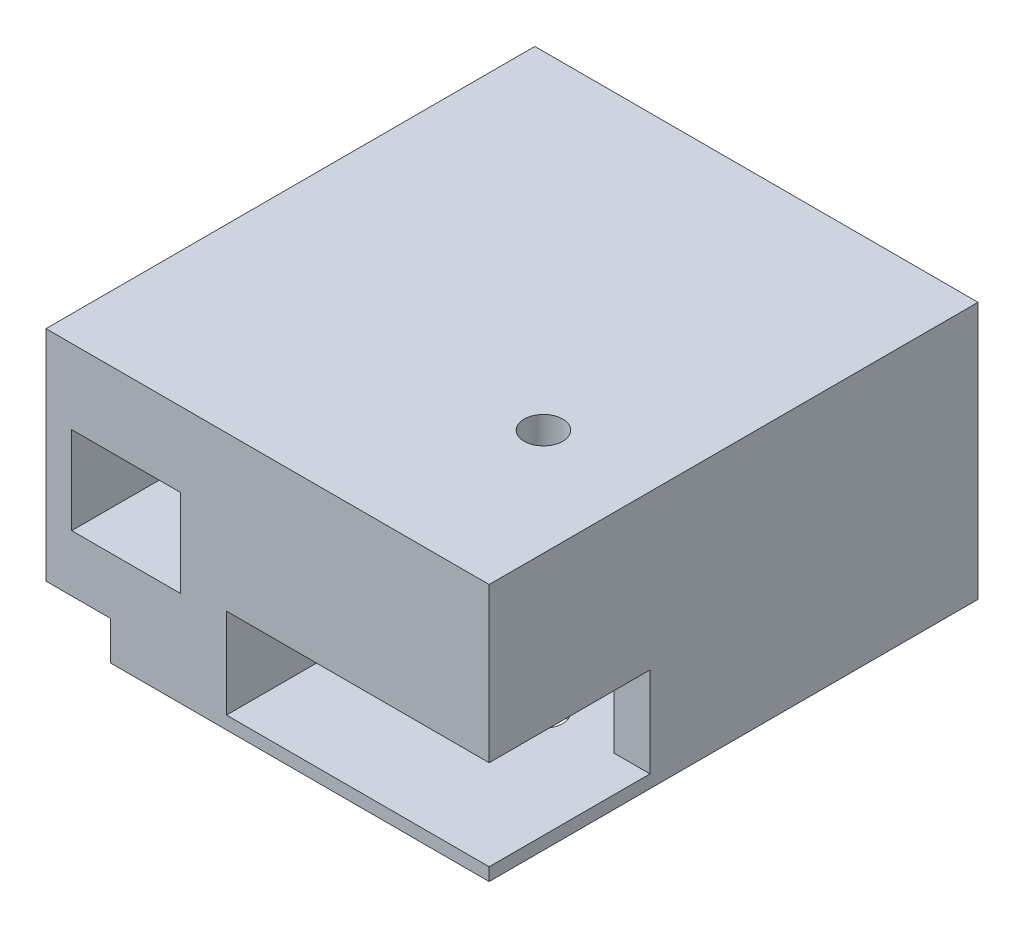
ISO-10303-21;
HEADER;
FILE_DESCRIPTION(('STEP AP214'),'2;1');
FILE_NAME('part.step','',(''),(''),'','','');
FILE_SCHEMA(('AUTOMOTIVE_DESIGN { 1 0 10303 214 1 1 1 1 }'));
ENDSEC;
DATA;
#1=APPLICATION_CONTEXT('core data for automotive mechanical design processes');
#2=APPLICATION_PROTOCOL_DEFINITION('international standard','automotive_design',2000,#1);
#3=PRODUCT_CONTEXT('',#1,'mechanical');
#4=PRODUCT('Part','Part','',(#3));
#5=PRODUCT_RELATED_PRODUCT_CATEGORY('part','',(#4));
#6=PRODUCT_DEFINITION_FORMATION('','',#4);
#7=PRODUCT_DEFINITION_CONTEXT('part definition',#1,'design');
#8=PRODUCT_DEFINITION('design','',#6,#7);
#9=PRODUCT_DEFINITION_SHAPE('','',#8);
#10=(LENGTH_UNIT() NAMED_UNIT(*) SI_UNIT(.MILLI.,.METRE.));
#11=(NAMED_UNIT(*) PLANE_ANGLE_UNIT() SI_UNIT($,.RADIAN.));
#12=(NAMED_UNIT(*) SI_UNIT($,.STERADIAN.) SOLID_ANGLE_UNIT());
#13=UNCERTAINTY_MEASURE_WITH_UNIT(LENGTH_MEASURE(1.E-05),#10,'distance_accuracy_value','');
#14=(GEOMETRIC_REPRESENTATION_CONTEXT(3) GLOBAL_UNCERTAINTY_ASSIGNED_CONTEXT((#13)) GLOBAL_UNIT_ASSIGNED_CONTEXT((#10,
#11,#12)) REPRESENTATION_CONTEXT('',''));
#15=CARTESIAN_POINT('',(0.,0.,0.));
#16=DIRECTION('',(0.,0.,1.));
#17=DIRECTION('',(1.,0.,0.));
#18=AXIS2_PLACEMENT_3D('',#15,#16,#17);
#19=CARTESIAN_POINT('',(13.8040015521384,-500000.,0.));
#20=DIRECTION('',(1.,0.,0.));
#21=DIRECTION('',(0.,0.,1.));
#22=AXIS2_PLACEMENT_3D('',#19,#20,#21);
#23=PLANE('',#22);
#24=DIRECTION('',(0.,-1.,0.));
#25=VECTOR('',#24,1.);
#26=CARTESIAN_POINT('',(13.8040015521384,27.0405469874742,20.7543072160116));
#27=LINE('',#26,#25);
#28=CARTESIAN_POINT('',(13.8040015521384,-2.62855974392551,20.7543072160116));
#29=VERTEX_POINT('',#28);
#30=CARTESIAN_POINT('',(13.8040015521384,4.37144025606545,20.7543072160116));
#31=VERTEX_POINT('',#30);
#32=EDGE_CURVE('E11',#29,#31,#27,.F.);
#33=ORIENTED_EDGE('',*,*,#32,.T.);
#34=DIRECTION('',(0.,0.,1.));
#35=VECTOR('',#34,1.);
#36=CARTESIAN_POINT('',(13.8040015521384,4.37144025606545,0.));
#37=LINE('',#36,#35);
#38=CARTESIAN_POINT('',(13.8040015521384,4.37144025606545,0.));
#39=VERTEX_POINT('',#38);
#40=EDGE_CURVE('E314',#39,#31,#37,.T.);
#41=ORIENTED_EDGE('',*,*,#40,.F.);
#42=DIRECTION('',(0.,1.,0.));
#43=VECTOR('',#42,1.);
#44=CARTESIAN_POINT('',(13.8040015521384,-500000.,0.));
#45=LINE('',#44,#43);
#46=CARTESIAN_POINT('',(13.8040015521384,-2.62855974403919,0.));
#47=VERTEX_POINT('',#46);
#48=EDGE_CURVE('E319',#47,#39,#45,.T.);
#49=ORIENTED_EDGE('',*,*,#48,.F.);
#50=DIRECTION('',(0.,0.,-1.));
#51=VECTOR('',#50,1.);
#52=CARTESIAN_POINT('',(13.8040015521384,-2.62855974392551,0.));
#53=LINE('',#52,#51);
#54=EDGE_CURVE('E322',#29,#47,#53,.T.);
#55=ORIENTED_EDGE('',*,*,#54,.F.);
#56=EDGE_LOOP('',(#33,#41,#49,#55));
#57=FACE_BOUND('',#56,.T.);
#58=ADVANCED_FACE('F35',(#57),#23,.F.);
#59=CARTESIAN_POINT('',(0.,4.37144025606545,38.));
#60=DIRECTION('',(0.,1.,0.));
#61=DIRECTION('',(0.,0.,-1.));
#62=AXIS2_PLACEMENT_3D('',#59,#60,#61);
#63=PLANE('',#62);
#64=DIRECTION('',(0.,0.,-1.));
#65=VECTOR('',#64,1.);
#66=CARTESIAN_POINT('',(-1.11381195359548,4.37144025606545,38.));
#67=LINE('',#66,#65);
#68=CARTESIAN_POINT('',(-1.11381195359548,4.37144025606545,38.));
#69=VERTEX_POINT('',#68);
#70=CARTESIAN_POINT('',(-1.11381195359548,4.37144025606545,0.));
#71=VERTEX_POINT('',#70);
#72=EDGE_CURVE('E240',#69,#71,#67,.T.);
#73=ORIENTED_EDGE('',*,*,#72,.T.);
#74=DIRECTION('',(-1.,0.,0.));
#75=VECTOR('',#74,1.);
#76=CARTESIAN_POINT('',(0.,4.37144025606545,0.));
#77=LINE('',#76,#75);
#78=EDGE_CURVE('E218',#39,#71,#77,.T.);
#79=ORIENTED_EDGE('',*,*,#78,.F.);
#80=ORIENTED_EDGE('',*,*,#40,.T.);
#81=CARTESIAN_POINT('',(11.0240015521384,4.37144025606545,25.5));
#82=DIRECTION('',(0.,-1.,0.));
#83=DIRECTION('',(0.,0.,-1.));
#84=AXIS2_PLACEMENT_3D('',#81,#82,#83);
#85=CIRCLE('',#84,5.5);
#86=CARTESIAN_POINT('',(16.5240015521383,4.37144025606545,25.5));
#87=VERTEX_POINT('',#86);
#88=EDGE_CURVE('E341',#31,#87,#85,.T.);
#89=ORIENTED_EDGE('',*,*,#88,.T.);
#90=DIRECTION('',(1.,0.,0.));
#91=VECTOR('',#90,1.);
#92=CARTESIAN_POINT('',(0.,4.37144025606545,25.5));
#93=LINE('',#92,#91);
#94=CARTESIAN_POINT('',(19.3040015521384,4.37144025606545,25.5));
#95=VERTEX_POINT('',#94);
#96=EDGE_CURVE('E338',#87,#95,#93,.T.);
#97=ORIENTED_EDGE('',*,*,#96,.T.);
#98=DIRECTION('',(0.,0.,1.));
#99=VECTOR('',#98,1.);
#100=CARTESIAN_POINT('',(19.3040015521384,4.37144025606545,0.));
#101=LINE('',#100,#99);
#102=CARTESIAN_POINT('',(19.3040015521384,4.37144025606545,38.));
#103=VERTEX_POINT('',#102);
#104=EDGE_CURVE('E333',#95,#103,#101,.T.);
#105=ORIENTED_EDGE('',*,*,#104,.T.);
#106=DIRECTION('',(-1.,0.,0.));
#107=VECTOR('',#106,1.);
#108=CARTESIAN_POINT('',(0.,4.37144025606545,38.));
#109=LINE('',#108,#107);
#110=EDGE_CURVE('E191',#103,#69,#109,.T.);
#111=ORIENTED_EDGE('',*,*,#110,.T.);
#112=EDGE_LOOP('',(#73,#79,#80,#89,#97,#105,#111));
#113=FACE_BOUND('',#112,.T.);
#114=CARTESIAN_POINT('',(11.0240015521384,4.37144025606545,25.5));
#115=DIRECTION('',(0.,-1.,0.));
#116=DIRECTION('',(0.,0.,-1.));
#117=AXIS2_PLACEMENT_3D('',#114,#115,#116);
#118=CIRCLE('',#117,1.5);
#119=CARTESIAN_POINT('',(12.5240015521384,4.37144025606545,25.5));
#120=VERTEX_POINT('',#119);
#121=EDGE_CURVE('E287',#120,#120,#118,.F.);
#122=ORIENTED_EDGE('',*,*,#121,.T.);
#123=EDGE_LOOP('',(#122));
#124=FACE_BOUND('',#123,.T.);
#125=ADVANCED_FACE('F360',(#113,#124),#63,.F.);
#126=CARTESIAN_POINT('',(0.,-2.62855974393456,38.));
#127=DIRECTION('',(0.,1.,0.));
#128=DIRECTION('',(-1.,0.,0.));
#129=AXIS2_PLACEMENT_3D('',#126,#127,#128);
#130=PLANE('',#129);
#131=CARTESIAN_POINT('',(11.0240015521384,-2.62855974393455,25.5));
#132=DIRECTION('',(0.,-1.,0.));
#133=DIRECTION('',(-1.,0.,0.));
#134=AXIS2_PLACEMENT_3D('',#131,#132,#133);
#135=CIRCLE('',#134,1.5);
#136=CARTESIAN_POINT('',(12.5240015521384,-2.62855974393455,25.5));
#137=VERTEX_POINT('',#136);
#138=EDGE_CURVE('E290',#137,#137,#135,.F.);
#139=ORIENTED_EDGE('',*,*,#138,.F.);
#140=EDGE_LOOP('',(#139));
#141=FACE_BOUND('',#140,.T.);
#142=DIRECTION('',(-1.,0.,0.));
#143=VECTOR('',#142,1.);
#144=CARTESIAN_POINT('',(0.,-2.62855974393456,38.));
#145=LINE('',#144,#143);
#146=CARTESIAN_POINT('',(19.3040015521384,-2.62855974393455,38.));
#147=VERTEX_POINT('',#146);
#148=CARTESIAN_POINT('',(-1.11381195359548,-2.62855974393456,38.));
#149=VERTEX_POINT('',#148);
#150=EDGE_CURVE('E167',#147,#149,#145,.T.);
#151=ORIENTED_EDGE('',*,*,#150,.F.);
#152=DIRECTION('',(0.,0.,1.));
#153=VECTOR('',#152,1.);
#154=CARTESIAN_POINT('',(19.3040015521384,-2.62855974393455,0.));
#155=LINE('',#154,#153);
#156=CARTESIAN_POINT('',(19.3040015521384,-2.62855974393455,25.5));
#157=VERTEX_POINT('',#156);
#158=EDGE_CURVE('E177',#157,#147,#155,.T.);
#159=ORIENTED_EDGE('',*,*,#158,.F.);
#160=DIRECTION('',(1.,0.,0.));
#161=VECTOR('',#160,1.);
#162=CARTESIAN_POINT('',(0.,-2.62855974393456,25.5));
#163=LINE('',#162,#161);
#164=CARTESIAN_POINT('',(16.5240015521384,-2.62855974393455,25.5));
#165=VERTEX_POINT('',#164);
#166=EDGE_CURVE('E335',#165,#157,#163,.T.);
#167=ORIENTED_EDGE('',*,*,#166,.F.);
#168=CARTESIAN_POINT('',(11.0240015521384,-2.62855974393455,25.5));
#169=DIRECTION('',(0.,-1.,0.));
#170=DIRECTION('',(-1.,0.,0.));
#171=AXIS2_PLACEMENT_3D('',#168,#169,#170);
#172=CIRCLE('',#171,5.5);
#173=EDGE_CURVE('E50',#29,#165,#172,.T.);
#174=ORIENTED_EDGE('',*,*,#173,.F.);
#175=ORIENTED_EDGE('',*,*,#54,.T.);
#176=DIRECTION('',(-1.,0.,0.));
#177=VECTOR('',#176,1.);
#178=CARTESIAN_POINT('',(0.,-2.62855974393456,0.));
#179=LINE('',#178,#177);
#180=CARTESIAN_POINT('',(-1.11381195359548,-2.62855974393456,0.));
#181=VERTEX_POINT('',#180);
#182=EDGE_CURVE('E213',#47,#181,#179,.T.);
#183=ORIENTED_EDGE('',*,*,#182,.T.);
#184=DIRECTION('',(0.,0.,-1.));
#185=VECTOR('',#184,1.);
#186=CARTESIAN_POINT('',(-1.11381195359548,-2.62855974393456,38.));
#187=LINE('',#186,#185);
#188=EDGE_CURVE('E188',#149,#181,#187,.T.);
#189=ORIENTED_EDGE('',*,*,#188,.F.);
#190=EDGE_LOOP('',(#151,#159,#167,#174,#175,#183,#189));
#191=FACE_BOUND('',#190,.T.);
#192=ADVANCED_FACE('F185',(#141,#191),#130,.T.);
#193=CARTESIAN_POINT('',(0.,3.77144025606545,38.));
#194=DIRECTION('',(0.,1.,0.));
#195=DIRECTION('',(-1.,0.,0.));
#196=AXIS2_PLACEMENT_3D('',#193,#194,#195);
#197=PLANE('',#196);
#198=DIRECTION('',(-1.,0.,0.));
#199=VECTOR('',#198,1.);
#200=CARTESIAN_POINT('',(0.,3.77144025606545,38.));
#201=LINE('',#200,#199);
#202=CARTESIAN_POINT('',(-4.69599844786163,3.77144025606545,38.));
#203=VERTEX_POINT('',#202);
#204=CARTESIAN_POINT('',(-13.1459984478616,3.77144025606545,38.));
#205=VERTEX_POINT('',#204);
#206=EDGE_CURVE('E206',#203,#205,#201,.T.);
#207=ORIENTED_EDGE('',*,*,#206,.F.);
#208=DIRECTION('',(0.,0.,-1.));
#209=VECTOR('',#208,1.);
#210=CARTESIAN_POINT('',(-4.69599844786163,3.77144025606545,38.));
#211=LINE('',#210,#209);
#212=CARTESIAN_POINT('',(-4.69599844786164,3.77144025606545,0.));
#213=VERTEX_POINT('',#212);
#214=EDGE_CURVE('E306',#203,#213,#211,.T.);
#215=ORIENTED_EDGE('',*,*,#214,.T.);
#216=DIRECTION('',(-1.,0.,0.));
#217=VECTOR('',#216,1.);
#218=CARTESIAN_POINT('',(0.,3.77144025606545,0.));
#219=LINE('',#218,#217);
#220=CARTESIAN_POINT('',(-13.1459984478616,3.77144025606545,0.));
#221=VERTEX_POINT('',#220);
#222=EDGE_CURVE('E226',#213,#221,#219,.T.);
#223=ORIENTED_EDGE('',*,*,#222,.T.);
#224=DIRECTION('',(0.,0.,1.));
#225=VECTOR('',#224,1.);
#226=CARTESIAN_POINT('',(-13.1459984478616,3.77144025606545,38.));
#227=LINE('',#226,#225);
#228=EDGE_CURVE('E309',#221,#205,#227,.T.);
#229=ORIENTED_EDGE('',*,*,#228,.T.);
#230=EDGE_LOOP('',(#207,#215,#223,#229));
#231=FACE_BOUND('',#230,.T.);
#232=ADVANCED_FACE('F410',(#231),#197,.T.);
#233=CARTESIAN_POINT('',(0.,10.5714402560654,38.));
#234=DIRECTION('',(0.,1.,0.));
#235=DIRECTION('',(-1.,0.,0.));
#236=AXIS2_PLACEMENT_3D('',#233,#234,#235);
#237=PLANE('',#236);
#238=DIRECTION('',(0.,0.,1.));
#239=VECTOR('',#238,1.);
#240=CARTESIAN_POINT('',(-13.1459984478616,10.5714402560579,38.));
#241=LINE('',#240,#239);
#242=CARTESIAN_POINT('',(-13.1459984478616,10.5714402560654,0.));
#243=VERTEX_POINT('',#242);
#244=CARTESIAN_POINT('',(-13.1459984478616,10.5714402560654,38.));
#245=VERTEX_POINT('',#244);
#246=EDGE_CURVE('E310',#243,#245,#241,.T.);
#247=ORIENTED_EDGE('',*,*,#246,.F.);
#248=DIRECTION('',(-1.,0.,0.));
#249=VECTOR('',#248,1.);
#250=CARTESIAN_POINT('',(0.,10.5714402560654,0.));
#251=LINE('',#250,#249);
#252=CARTESIAN_POINT('',(-4.69599844786164,10.5714402560654,0.));
#253=VERTEX_POINT('',#252);
#254=EDGE_CURVE('E223',#253,#243,#251,.T.);
#255=ORIENTED_EDGE('',*,*,#254,.F.);
#256=DIRECTION('',(0.,0.,-1.));
#257=VECTOR('',#256,1.);
#258=CARTESIAN_POINT('',(-4.69599844786163,10.5714402560579,38.));
#259=LINE('',#258,#257);
#260=CARTESIAN_POINT('',(-4.69599844786163,10.5714402560654,38.));
#261=VERTEX_POINT('',#260);
#262=EDGE_CURVE('E299',#261,#253,#259,.T.);
#263=ORIENTED_EDGE('',*,*,#262,.F.);
#264=DIRECTION('',(-1.,0.,0.));
#265=VECTOR('',#264,1.);
#266=CARTESIAN_POINT('',(0.,10.5714402560654,38.));
#267=LINE('',#266,#265);
#268=EDGE_CURVE('E204',#261,#245,#267,.T.);
#269=ORIENTED_EDGE('',*,*,#268,.T.);
#270=EDGE_LOOP('',(#247,#255,#263,#269));
#271=FACE_BOUND('',#270,.T.);
#272=ADVANCED_FACE('F412',(#271),#237,.F.);
#273=CARTESIAN_POINT('',(-10.1459984478616,0.,38.));
#274=DIRECTION('',(-1.,0.,0.));
#275=DIRECTION('',(0.,0.,-1.));
#276=AXIS2_PLACEMENT_3D('',#273,#274,#275);
#277=PLANE('',#276);
#278=DIRECTION('',(0.,0.,-1.));
#279=VECTOR('',#278,1.);
#280=CARTESIAN_POINT('',(-10.1459984478616,-3.62855974393455,38.));
#281=LINE('',#280,#279);
#282=CARTESIAN_POINT('',(-10.1459984478616,-3.62855974393455,38.));
#283=VERTEX_POINT('',#282);
#284=CARTESIAN_POINT('',(-10.1459984478616,-3.62855974393455,16.));
#285=VERTEX_POINT('',#284);
#286=EDGE_CURVE('E210',#283,#285,#281,.T.);
#287=ORIENTED_EDGE('',*,*,#286,.F.);
#288=DIRECTION('',(0.,-1.,0.));
#289=VECTOR('',#288,1.);
#290=CARTESIAN_POINT('',(-10.1459984478616,0.,38.));
#291=LINE('',#290,#289);
#292=CARTESIAN_POINT('',(-10.1459984478616,-0.628559743934557,38.));
#293=VERTEX_POINT('',#292);
#294=EDGE_CURVE('E193',#293,#283,#291,.T.);
#295=ORIENTED_EDGE('',*,*,#294,.F.);
#296=DIRECTION('',(0.,0.,-1.));
#297=VECTOR('',#296,1.);
#298=CARTESIAN_POINT('',(-10.1459984478616,-0.628559743934557,38.));
#299=LINE('',#298,#297);
#300=CARTESIAN_POINT('',(-10.1459984478616,-0.628559743934557,16.));
#301=VERTEX_POINT('',#300);
#302=EDGE_CURVE('E43',#293,#301,#299,.T.);
#303=ORIENTED_EDGE('',*,*,#302,.T.);
#304=DIRECTION('',(0.,-1.,0.));
#305=VECTOR('',#304,1.);
#306=CARTESIAN_POINT('',(-10.1459984478616,0.,16.));
#307=LINE('',#306,#305);
#308=EDGE_CURVE('E173',#301,#285,#307,.T.);
#309=ORIENTED_EDGE('',*,*,#308,.T.);
#310=EDGE_LOOP('',(#287,#295,#303,#309));
#311=FACE_BOUND('',#310,.T.);
#312=ADVANCED_FACE('F37',(#311),#277,.T.);
#313=CARTESIAN_POINT('',(0.,-0.628559743934557,38.));
#314=DIRECTION('',(0.,-1.,0.));
#315=DIRECTION('',(0.,0.,1.));
#316=AXIS2_PLACEMENT_3D('',#313,#314,#315);
#317=PLANE('',#316);
#318=ORIENTED_EDGE('',*,*,#302,.F.);
#319=DIRECTION('',(1.,0.,0.));
#320=VECTOR('',#319,1.);
#321=CARTESIAN_POINT('',(0.,-0.628559743934557,38.));
#322=LINE('',#321,#320);
#323=CARTESIAN_POINT('',(-15.1459984478616,-0.628559743934557,38.));
#324=VERTEX_POINT('',#323);
#325=EDGE_CURVE('E208',#324,#293,#322,.T.);
#326=ORIENTED_EDGE('',*,*,#325,.F.);
#327=DIRECTION('',(0.,0.,-1.));
#328=VECTOR('',#327,1.);
#329=CARTESIAN_POINT('',(-15.1459984478616,-0.628559743934557,38.));
#330=LINE('',#329,#328);
#331=CARTESIAN_POINT('',(-15.1459984478616,-0.628559743934557,16.));
#332=VERTEX_POINT('',#331);
#333=EDGE_CURVE('E234',#324,#332,#330,.T.);
#334=ORIENTED_EDGE('',*,*,#333,.T.);
#335=DIRECTION('',(1.,0.,0.));
#336=VECTOR('',#335,1.);
#337=CARTESIAN_POINT('',(0.,-0.628559743934557,16.));
#338=LINE('',#337,#336);
#339=EDGE_CURVE('E257',#332,#301,#338,.T.);
#340=ORIENTED_EDGE('',*,*,#339,.T.);
#341=EDGE_LOOP('',(#318,#326,#334,#340));
#342=FACE_BOUND('',#341,.T.);
#343=ADVANCED_FACE('F268',(#342),#317,.T.);
#344=CARTESIAN_POINT('',(-15.1459984478616,0.,38.));
#345=DIRECTION('',(1.,0.,0.));
#346=DIRECTION('',(0.,0.,1.));
#347=AXIS2_PLACEMENT_3D('',#344,#345,#346);
#348=PLANE('',#347);
#349=CARTESIAN_POINT('',(-15.1459984478616,7.07285546333414,5.5));
#350=DIRECTION('',(1.,0.,0.));
#351=DIRECTION('',(0.,0.,-1.));
#352=AXIS2_PLACEMENT_3D('',#349,#350,#351);
#353=CIRCLE('',#352,1.5);
#354=CARTESIAN_POINT('',(-15.1459984478616,7.07285546333414,4.));
#355=VERTEX_POINT('',#354);
#356=EDGE_CURVE('E326',#355,#355,#353,.T.);
#357=ORIENTED_EDGE('',*,*,#356,.T.);
#358=EDGE_LOOP('',(#357));
#359=FACE_BOUND('',#358,.T.);
#360=DIRECTION('',(0.,1.,0.));
#361=VECTOR('',#360,1.);
#362=CARTESIAN_POINT('',(-15.1459984478616,0.,0.));
#363=LINE('',#362,#361);
#364=CARTESIAN_POINT('',(-15.1459984478616,-3.62855974393455,0.));
#365=VERTEX_POINT('',#364);
#366=CARTESIAN_POINT('',(-15.1459984478616,16.3714402560654,0.));
#367=VERTEX_POINT('',#366);
#368=EDGE_CURVE('E229',#365,#367,#363,.T.);
#369=ORIENTED_EDGE('',*,*,#368,.F.);
#370=DIRECTION('',(0.,0.,-1.));
#371=VECTOR('',#370,1.);
#372=CARTESIAN_POINT('',(-15.1459984478616,-3.62855974393455,16.));
#373=LINE('',#372,#371);
#374=CARTESIAN_POINT('',(-15.1459984478616,-3.62855974393455,16.));
#375=VERTEX_POINT('',#374);
#376=EDGE_CURVE('E214',#375,#365,#373,.T.);
#377=ORIENTED_EDGE('',*,*,#376,.F.);
#378=DIRECTION('',(0.,1.,0.));
#379=VECTOR('',#378,1.);
#380=CARTESIAN_POINT('',(-15.1459984478616,0.,16.));
#381=LINE('',#380,#379);
#382=EDGE_CURVE('E259',#375,#332,#381,.T.);
#383=ORIENTED_EDGE('',*,*,#382,.T.);
#384=ORIENTED_EDGE('',*,*,#333,.F.);
#385=DIRECTION('',(0.,1.,0.));
#386=VECTOR('',#385,1.);
#387=CARTESIAN_POINT('',(-15.1459984478616,0.,38.));
#388=LINE('',#387,#386);
#389=CARTESIAN_POINT('',(-15.1459984478616,16.3714402560654,38.));
#390=VERTEX_POINT('',#389);
#391=EDGE_CURVE('E201',#324,#390,#388,.T.);
#392=ORIENTED_EDGE('',*,*,#391,.T.);
#393=DIRECTION('',(0.,0.,-1.));
#394=VECTOR('',#393,1.);
#395=CARTESIAN_POINT('',(-15.1459984478616,16.3714402560654,38.));
#396=LINE('',#395,#394);
#397=EDGE_CURVE('E237',#390,#367,#396,.T.);
#398=ORIENTED_EDGE('',*,*,#397,.T.);
#399=EDGE_LOOP('',(#369,#377,#383,#384,#392,#398));
#400=FACE_BOUND('',#399,.T.);
#401=ADVANCED_FACE('F273',(#359,#400),#348,.F.);
#402=CARTESIAN_POINT('',(0.,16.3714402560654,38.));
#403=DIRECTION('',(0.,1.,0.));
#404=DIRECTION('',(-1.,0.,0.));
#405=AXIS2_PLACEMENT_3D('',#402,#403,#404);
#406=PLANE('',#405);
#407=CARTESIAN_POINT('',(11.0240015521384,16.3714402560654,25.5));
#408=DIRECTION('',(0.,-1.,0.));
#409=DIRECTION('',(-1.,0.,0.));
#410=AXIS2_PLACEMENT_3D('',#407,#408,#409);
#411=CIRCLE('',#410,1.5);
#412=CARTESIAN_POINT('',(12.5240015521383,16.3714402560655,25.5));
#413=VERTEX_POINT('',#412);
#414=EDGE_CURVE('E293',#413,#413,#411,.T.);
#415=ORIENTED_EDGE('',*,*,#414,.T.);
#416=EDGE_LOOP('',(#415));
#417=FACE_BOUND('',#416,.T.);
#418=DIRECTION('',(-1.,0.,0.));
#419=VECTOR('',#418,1.);
#420=CARTESIAN_POINT('',(0.,16.3714402560654,38.));
#421=LINE('',#420,#419);
#422=CARTESIAN_POINT('',(19.3040015521384,16.3714402560655,38.));
#423=VERTEX_POINT('',#422);
#424=EDGE_CURVE('E199',#423,#390,#421,.T.);
#425=ORIENTED_EDGE('',*,*,#424,.F.);
#426=DIRECTION('',(0.,0.,-1.));
#427=VECTOR('',#426,1.);
#428=CARTESIAN_POINT('',(19.3040015521384,16.3714402560655,0.));
#429=LINE('',#428,#427);
#430=CARTESIAN_POINT('',(19.3040015521384,16.3714402560655,0.));
#431=VERTEX_POINT('',#430);
#432=EDGE_CURVE('E283',#423,#431,#429,.T.);
#433=ORIENTED_EDGE('',*,*,#432,.T.);
#434=DIRECTION('',(-1.,0.,0.));
#435=VECTOR('',#434,1.);
#436=CARTESIAN_POINT('',(0.,16.3714402560654,0.));
#437=LINE('',#436,#435);
#438=EDGE_CURVE('E221',#431,#367,#437,.T.);
#439=ORIENTED_EDGE('',*,*,#438,.T.);
#440=ORIENTED_EDGE('',*,*,#397,.F.);
#441=EDGE_LOOP('',(#425,#433,#439,#440));
#442=FACE_BOUND('',#441,.T.);
#443=ADVANCED_FACE('F365',(#417,#442),#406,.T.);
#444=CARTESIAN_POINT('',(-1.11381195359548,0.,38.));
#445=DIRECTION('',(-1.,0.,0.));
#446=DIRECTION('',(0.,-1.,0.));
#447=AXIS2_PLACEMENT_3D('',#444,#445,#446);
#448=PLANE('',#447);
#449=DIRECTION('',(0.,-1.,0.));
#450=VECTOR('',#449,1.);
#451=CARTESIAN_POINT('',(-1.11381195359548,0.,0.));
#452=LINE('',#451,#450);
#453=EDGE_CURVE('E216',#71,#181,#452,.T.);
#454=ORIENTED_EDGE('',*,*,#453,.F.);
#455=ORIENTED_EDGE('',*,*,#72,.F.);
#456=DIRECTION('',(0.,-1.,0.));
#457=VECTOR('',#456,1.);
#458=CARTESIAN_POINT('',(-1.11381195359548,0.,38.));
#459=LINE('',#458,#457);
#460=EDGE_CURVE('E189',#69,#149,#459,.T.);
#461=ORIENTED_EDGE('',*,*,#460,.T.);
#462=ORIENTED_EDGE('',*,*,#188,.T.);
#463=EDGE_LOOP('',(#454,#455,#461,#462));
#464=FACE_BOUND('',#463,.T.);
#465=ADVANCED_FACE('F357',(#464),#448,.F.);
#466=CARTESIAN_POINT('',(0.,-3.62855974393455,38.));
#467=DIRECTION('',(0.,1.,0.));
#468=DIRECTION('',(-1.,0.,0.));
#469=AXIS2_PLACEMENT_3D('',#466,#467,#468);
#470=PLANE('',#469);
#471=CARTESIAN_POINT('',(11.0240015521384,-3.62855974393455,25.5));
#472=DIRECTION('',(0.,-1.,0.));
#473=DIRECTION('',(-1.,0.,0.));
#474=AXIS2_PLACEMENT_3D('',#471,#472,#473);
#475=CIRCLE('',#474,1.5);
#476=CARTESIAN_POINT('',(12.5240015521384,-3.62855974393455,25.5));
#477=VERTEX_POINT('',#476);
#478=EDGE_CURVE('E296',#477,#477,#475,.F.);
#479=ORIENTED_EDGE('',*,*,#478,.T.);
#480=EDGE_LOOP('',(#479));
#481=FACE_BOUND('',#480,.T.);
#482=ORIENTED_EDGE('',*,*,#286,.T.);
#483=DIRECTION('',(-1.,0.,0.));
#484=VECTOR('',#483,1.);
#485=CARTESIAN_POINT('',(0.,-3.62855974393455,16.));
#486=LINE('',#485,#484);
#487=EDGE_CURVE('E248',#285,#375,#486,.T.);
#488=ORIENTED_EDGE('',*,*,#487,.T.);
#489=ORIENTED_EDGE('',*,*,#376,.T.);
#490=DIRECTION('',(-1.,0.,0.));
#491=VECTOR('',#490,1.);
#492=CARTESIAN_POINT('',(0.,-3.62855974393455,0.));
#493=LINE('',#492,#491);
#494=CARTESIAN_POINT('',(19.3040015521384,-3.62855974393455,0.));
#495=VERTEX_POINT('',#494);
#496=EDGE_CURVE('E211',#495,#365,#493,.T.);
#497=ORIENTED_EDGE('',*,*,#496,.F.);
#498=DIRECTION('',(0.,0.,1.));
#499=VECTOR('',#498,1.);
#500=CARTESIAN_POINT('',(19.3040015521384,-3.62855974393455,0.));
#501=LINE('',#500,#499);
#502=CARTESIAN_POINT('',(19.3040015521384,-3.62855974393455,38.));
#503=VERTEX_POINT('',#502);
#504=EDGE_CURVE('E275',#495,#503,#501,.T.);
#505=ORIENTED_EDGE('',*,*,#504,.T.);
#506=DIRECTION('',(-1.,0.,0.));
#507=VECTOR('',#506,1.);
#508=CARTESIAN_POINT('',(0.,-3.62855974393455,38.));
#509=LINE('',#508,#507);
#510=EDGE_CURVE('E169',#503,#283,#509,.T.);
#511=ORIENTED_EDGE('',*,*,#510,.T.);
#512=EDGE_LOOP('',(#482,#488,#489,#497,#505,#511));
#513=FACE_BOUND('',#512,.T.);
#514=ADVANCED_FACE('F246',(#481,#513),#470,.F.);
#515=CARTESIAN_POINT('',(0.,0.,38.));
#516=DIRECTION('',(0.,0.,-1.));
#517=DIRECTION('',(1.,0.,0.));
#518=AXIS2_PLACEMENT_3D('',#515,#516,#517);
#519=PLANE('',#518);
#520=DIRECTION('',(0.,1.,0.));
#521=VECTOR('',#520,1.);
#522=CARTESIAN_POINT('',(19.3040015521384,-2.62855974393455,38.));
#523=LINE('',#522,#521);
#524=EDGE_CURVE('E174',#103,#423,#523,.T.);
#525=ORIENTED_EDGE('',*,*,#524,.T.);
#526=ORIENTED_EDGE('',*,*,#424,.T.);
#527=ORIENTED_EDGE('',*,*,#391,.F.);
#528=ORIENTED_EDGE('',*,*,#325,.T.);
#529=ORIENTED_EDGE('',*,*,#294,.T.);
#530=ORIENTED_EDGE('',*,*,#510,.F.);
#531=EDGE_CURVE('E163',#503,#147,#523,.T.);
#532=ORIENTED_EDGE('',*,*,#531,.T.);
#533=ORIENTED_EDGE('',*,*,#150,.T.);
#534=ORIENTED_EDGE('',*,*,#460,.F.);
#535=ORIENTED_EDGE('',*,*,#110,.F.);
#536=EDGE_LOOP('',(#525,#526,#527,#528,#529,#530,#532,#533,#534,#535));
#537=FACE_BOUND('',#536,.T.);
#538=DIRECTION('',(0.,-1.,0.));
#539=VECTOR('',#538,1.);
#540=CARTESIAN_POINT('',(-4.6959984479313,500000.,38.));
#541=LINE('',#540,#539);
#542=EDGE_CURVE('E302',#261,#203,#541,.T.);
#543=ORIENTED_EDGE('',*,*,#542,.T.);
#544=ORIENTED_EDGE('',*,*,#206,.T.);
#545=DIRECTION('',(0.,-1.,0.));
#546=VECTOR('',#545,1.);
#547=CARTESIAN_POINT('',(-13.1459984479313,500000.,38.));
#548=LINE('',#547,#546);
#549=EDGE_CURVE('E58',#245,#205,#548,.T.);
#550=ORIENTED_EDGE('',*,*,#549,.F.);
#551=ORIENTED_EDGE('',*,*,#268,.F.);
#552=EDGE_LOOP('',(#543,#544,#550,#551));
#553=FACE_BOUND('',#552,.T.);
#554=ADVANCED_FACE('F165',(#537,#553),#519,.F.);
#555=CARTESIAN_POINT('',(0.,0.,0.));
#556=DIRECTION('',(0.,0.,-1.));
#557=DIRECTION('',(1.,0.,0.));
#558=AXIS2_PLACEMENT_3D('',#555,#556,#557);
#559=PLANE('',#558);
#560=ORIENTED_EDGE('',*,*,#48,.T.);
#561=ORIENTED_EDGE('',*,*,#78,.T.);
#562=ORIENTED_EDGE('',*,*,#453,.T.);
#563=ORIENTED_EDGE('',*,*,#182,.F.);
#564=EDGE_LOOP('',(#560,#561,#562,#563));
#565=FACE_BOUND('',#564,.T.);
#566=ORIENTED_EDGE('',*,*,#438,.F.);
#567=DIRECTION('',(0.,-1.,0.));
#568=VECTOR('',#567,1.);
#569=CARTESIAN_POINT('',(19.3040015521384,-2.62855974393455,0.));
#570=LINE('',#569,#568);
#571=EDGE_CURVE('E280',#431,#495,#570,.T.);
#572=ORIENTED_EDGE('',*,*,#571,.T.);
#573=ORIENTED_EDGE('',*,*,#496,.T.);
#574=ORIENTED_EDGE('',*,*,#368,.T.);
#575=EDGE_LOOP('',(#566,#572,#573,#574));
#576=FACE_BOUND('',#575,.T.);
#577=ORIENTED_EDGE('',*,*,#254,.T.);
#578=DIRECTION('',(0.,-1.,0.));
#579=VECTOR('',#578,1.);
#580=CARTESIAN_POINT('',(-13.1459984479313,500000.,0.));
#581=LINE('',#580,#579);
#582=EDGE_CURVE('E313',#243,#221,#581,.T.);
#583=ORIENTED_EDGE('',*,*,#582,.T.);
#584=ORIENTED_EDGE('',*,*,#222,.F.);
#585=DIRECTION('',(0.,-1.,0.));
#586=VECTOR('',#585,1.);
#587=CARTESIAN_POINT('',(-4.69599844793131,500000.,0.));
#588=LINE('',#587,#586);
#589=EDGE_CURVE('E304',#253,#213,#588,.T.);
#590=ORIENTED_EDGE('',*,*,#589,.F.);
#591=EDGE_LOOP('',(#577,#583,#584,#590));
#592=FACE_BOUND('',#591,.T.);
#593=ADVANCED_FACE('F278',(#565,#576,#592),#559,.T.);
#594=CARTESIAN_POINT('',(0.,0.,16.));
#595=DIRECTION('',(0.,0.,-1.));
#596=DIRECTION('',(1.,0.,0.));
#597=AXIS2_PLACEMENT_3D('',#594,#595,#596);
#598=PLANE('',#597);
#599=ORIENTED_EDGE('',*,*,#308,.F.);
#600=ORIENTED_EDGE('',*,*,#339,.F.);
#601=ORIENTED_EDGE('',*,*,#382,.F.);
#602=ORIENTED_EDGE('',*,*,#487,.F.);
#603=EDGE_LOOP('',(#599,#600,#601,#602));
#604=FACE_BOUND('',#603,.T.);
#605=ADVANCED_FACE('F269',(#604),#598,.F.);
#606=CARTESIAN_POINT('',(19.3040015521384,0.,0.));
#607=DIRECTION('',(1.,0.,0.));
#608=DIRECTION('',(0.,0.,1.));
#609=AXIS2_PLACEMENT_3D('',#606,#607,#608);
#610=PLANE('',#609);
#611=ORIENTED_EDGE('',*,*,#104,.F.);
#612=DIRECTION('',(0.,-1.,0.));
#613=VECTOR('',#612,1.);
#614=CARTESIAN_POINT('',(19.3040015521383,27.0405469874742,25.5));
#615=LINE('',#614,#613);
#616=EDGE_CURVE('E180',#95,#157,#615,.T.);
#617=ORIENTED_EDGE('',*,*,#616,.T.);
#618=ORIENTED_EDGE('',*,*,#158,.T.);
#619=ORIENTED_EDGE('',*,*,#531,.F.);
#620=ORIENTED_EDGE('',*,*,#504,.F.);
#621=ORIENTED_EDGE('',*,*,#571,.F.);
#622=ORIENTED_EDGE('',*,*,#432,.F.);
#623=ORIENTED_EDGE('',*,*,#524,.F.);
#624=EDGE_LOOP('',(#611,#617,#618,#619,#620,#621,#622,#623));
#625=FACE_BOUND('',#624,.T.);
#626=ADVANCED_FACE('F179',(#625),#610,.T.);
#627=CARTESIAN_POINT('',(11.0240015521384,20.6140809431847,25.5));
#628=DIRECTION('',(0.,-1.,0.));
#629=DIRECTION('',(1.,0.,0.));
#630=AXIS2_PLACEMENT_3D('',#627,#628,#629);
#631=CYLINDRICAL_SURFACE('',#630,1.5);
#632=CARTESIAN_POINT('',(12.5240015521384,-2.62855974393455,25.5));
#633=CARTESIAN_POINT('',(12.5240015521384,-2.63897641060122,25.5));
#634=CARTESIAN_POINT('',(12.5240015521384,-2.64939307726788,25.5));
#635=CARTESIAN_POINT('',(12.5240015521384,-2.67022641060122,25.5));
#636=CARTESIAN_POINT('',(12.5240015521384,-2.68064307726788,25.5));
#637=CARTESIAN_POINT('',(12.5240015521384,-2.70147641060122,25.5));
#638=CARTESIAN_POINT('',(12.5240015521384,-2.71189307726788,25.5));
#639=CARTESIAN_POINT('',(12.5240015521384,-2.73272641060122,25.5));
#640=CARTESIAN_POINT('',(12.5240015521384,-2.74314307726788,25.5));
#641=CARTESIAN_POINT('',(12.5240015521384,-2.76397641060122,25.5));
#642=CARTESIAN_POINT('',(12.5240015521384,-2.77439307726788,25.5));
#643=CARTESIAN_POINT('',(12.5240015521384,-2.79522641060122,25.5));
#644=CARTESIAN_POINT('',(12.5240015521384,-2.80564307726788,25.5));
#645=CARTESIAN_POINT('',(12.5240015521384,-2.82647641060122,25.5));
#646=CARTESIAN_POINT('',(12.5240015521384,-2.83689307726788,25.5));
#647=CARTESIAN_POINT('',(12.5240015521384,-2.85772641060122,25.5));
#648=CARTESIAN_POINT('',(12.5240015521384,-2.86814307726788,25.5));
#649=CARTESIAN_POINT('',(12.5240015521384,-2.88897641060122,25.5));
#650=CARTESIAN_POINT('',(12.5240015521384,-2.89939307726788,25.5));
#651=CARTESIAN_POINT('',(12.5240015521384,-2.92022641060122,25.5));
#652=CARTESIAN_POINT('',(12.5240015521384,-2.93064307726788,25.5));
#653=CARTESIAN_POINT('',(12.5240015521384,-2.95147641060122,25.5));
#654=CARTESIAN_POINT('',(12.5240015521384,-2.96189307726788,25.5));
#655=CARTESIAN_POINT('',(12.5240015521384,-2.98272641060122,25.5));
#656=CARTESIAN_POINT('',(12.5240015521384,-2.99314307726788,25.5));
#657=CARTESIAN_POINT('',(12.5240015521384,-3.01397641060122,25.5));
#658=CARTESIAN_POINT('',(12.5240015521384,-3.02439307726788,25.5));
#659=CARTESIAN_POINT('',(12.5240015521384,-3.04522641060122,25.5));
#660=CARTESIAN_POINT('',(12.5240015521384,-3.05564307726788,25.5));
#661=CARTESIAN_POINT('',(12.5240015521384,-3.07647641060122,25.5));
#662=CARTESIAN_POINT('',(12.5240015521384,-3.08689307726788,25.5));
#663=CARTESIAN_POINT('',(12.5240015521384,-3.10772641060122,25.5));
#664=CARTESIAN_POINT('',(12.5240015521384,-3.11814307726788,25.5));
#665=CARTESIAN_POINT('',(12.5240015521384,-3.13897641060122,25.5));
#666=CARTESIAN_POINT('',(12.5240015521384,-3.14939307726788,25.5));
#667=CARTESIAN_POINT('',(12.5240015521384,-3.17022641060122,25.5));
#668=CARTESIAN_POINT('',(12.5240015521384,-3.18064307726788,25.5));
#669=CARTESIAN_POINT('',(12.5240015521384,-3.20147641060122,25.5));
#670=CARTESIAN_POINT('',(12.5240015521384,-3.21189307726788,25.5));
#671=CARTESIAN_POINT('',(12.5240015521384,-3.23272641060122,25.5));
#672=CARTESIAN_POINT('',(12.5240015521384,-3.24314307726788,25.5));
#673=CARTESIAN_POINT('',(12.5240015521384,-3.26397641060122,25.5));
#674=CARTESIAN_POINT('',(12.5240015521384,-3.27439307726788,25.5));
#675=CARTESIAN_POINT('',(12.5240015521384,-3.29522641060122,25.5));
#676=CARTESIAN_POINT('',(12.5240015521384,-3.30564307726788,25.5));
#677=CARTESIAN_POINT('',(12.5240015521384,-3.32647641060122,25.5));
#678=CARTESIAN_POINT('',(12.5240015521384,-3.33689307726788,25.5));
#679=CARTESIAN_POINT('',(12.5240015521384,-3.35772641060122,25.5));
#680=CARTESIAN_POINT('',(12.5240015521384,-3.36814307726788,25.5));
#681=CARTESIAN_POINT('',(12.5240015521384,-3.38897641060122,25.5));
#682=CARTESIAN_POINT('',(12.5240015521384,-3.39939307726788,25.5));
#683=CARTESIAN_POINT('',(12.5240015521384,-3.42022641060122,25.5));
#684=CARTESIAN_POINT('',(12.5240015521384,-3.43064307726788,25.5));
#685=CARTESIAN_POINT('',(12.5240015521384,-3.45147641060122,25.5));
#686=CARTESIAN_POINT('',(12.5240015521384,-3.46189307726788,25.5));
#687=CARTESIAN_POINT('',(12.5240015521384,-3.48272641060122,25.5));
#688=CARTESIAN_POINT('',(12.5240015521384,-3.49314307726788,25.5));
#689=CARTESIAN_POINT('',(12.5240015521384,-3.51397641060122,25.5));
#690=CARTESIAN_POINT('',(12.5240015521384,-3.52439307726788,25.5));
#691=CARTESIAN_POINT('',(12.5240015521384,-3.54522641060122,25.5));
#692=CARTESIAN_POINT('',(12.5240015521384,-3.55564307726788,25.5));
#693=CARTESIAN_POINT('',(12.5240015521384,-3.57647641060122,25.5));
#694=CARTESIAN_POINT('',(12.5240015521384,-3.58689307726788,25.5));
#695=CARTESIAN_POINT('',(12.5240015521384,-3.60772641060122,25.5));
#696=CARTESIAN_POINT('',(12.5240015521384,-3.61814307726788,25.5));
#697=CARTESIAN_POINT('',(12.5240015521384,-3.62855974393455,25.5));
#698=B_SPLINE_CURVE_WITH_KNOTS('',3,(#632,#633,#634,#635,#636,#637,#638,#639,#640,#641,#642,
#643,#644,#645,#646,#647,#648,#649,#650,#651,#652,#653,#654,#655,#656,#657,#658,#659,#660,#661,
#662,#663,#664,#665,#666,#667,#668,#669,#670,#671,#672,#673,#674,#675,#676,#677,#678,#679,#680,
#681,#682,#683,#684,#685,#686,#687,#688,#689,#690,#691,#692,#693,#694,#695,#696,#697),
.UNSPECIFIED.,.F.,.F.,(4,2,2,2,2,2,2,2,2,2,2,2,2,2,2,2,2,2,2,2,2,2,2,2,2,2,2,2,2,2,2,2,4),(0.,
0.03125,0.0625000000000001,0.0937500000000001,0.125,0.15625,0.1875,0.21875,0.25,0.28125,0.3125,
0.34375,0.375,0.40625,0.4375,0.46875,0.5,0.53125,0.5625,0.593750000000001,0.625000000000001,
0.656250000000001,0.687500000000001,0.718750000000001,0.750000000000001,0.781250000000001,
0.812500000000001,0.843750000000001,0.875000000000001,0.906250000000001,0.937500000000001,
0.968750000000001,1.),.UNSPECIFIED.);
#699=EDGE_CURVE('BSEAM396',#137,#477,#698,.T.);
#700=ORIENTED_EDGE('',*,*,#138,.T.);
#701=ORIENTED_EDGE('',*,*,#478,.F.);
#702=ORIENTED_EDGE('',*,*,#699,.T.);
#703=ORIENTED_EDGE('',*,*,#699,.F.);
#704=EDGE_LOOP('',(#700,#702,#701,#703));
#705=FACE_BOUND('',#704,.T.);
#706=ADVANCED_FACE('F396',(#705),#631,.F.);
#707=CARTESIAN_POINT('',(12.5240015521383,16.3714402560655,25.5));
#708=CARTESIAN_POINT('',(12.5240015521383,16.2464402560655,25.5));
#709=CARTESIAN_POINT('',(12.5240015521383,16.1214402560655,25.5));
#710=CARTESIAN_POINT('',(12.5240015521383,15.8714402560655,25.5));
#711=CARTESIAN_POINT('',(12.5240015521383,15.7464402560655,25.5));
#712=CARTESIAN_POINT('',(12.5240015521383,15.4964402560654,25.5));
#713=CARTESIAN_POINT('',(12.5240015521383,15.3714402560654,25.5));
#714=CARTESIAN_POINT('',(12.5240015521383,15.1214402560654,25.5));
#715=CARTESIAN_POINT('',(12.5240015521383,14.9964402560654,25.5));
#716=CARTESIAN_POINT('',(12.5240015521383,14.7464402560654,25.5));
#717=CARTESIAN_POINT('',(12.5240015521383,14.6214402560654,25.5));
#718=CARTESIAN_POINT('',(12.5240015521383,14.3714402560654,25.5));
#719=CARTESIAN_POINT('',(12.5240015521383,14.2464402560654,25.5));
#720=CARTESIAN_POINT('',(12.5240015521383,13.9964402560654,25.5));
#721=CARTESIAN_POINT('',(12.5240015521383,13.8714402560654,25.5));
#722=CARTESIAN_POINT('',(12.5240015521383,13.6214402560654,25.5));
#723=CARTESIAN_POINT('',(12.5240015521383,13.4964402560654,25.5));
#724=CARTESIAN_POINT('',(12.5240015521383,13.2464402560654,25.5));
#725=CARTESIAN_POINT('',(12.5240015521383,13.1214402560654,25.5));
#726=CARTESIAN_POINT('',(12.5240015521383,12.8714402560654,25.5));
#727=CARTESIAN_POINT('',(12.5240015521383,12.7464402560654,25.5));
#728=CARTESIAN_POINT('',(12.5240015521383,12.4964402560654,25.5));
#729=CARTESIAN_POINT('',(12.5240015521383,12.3714402560654,25.5));
#730=CARTESIAN_POINT('',(12.5240015521383,12.1214402560654,25.5));
#731=CARTESIAN_POINT('',(12.5240015521383,11.9964402560655,25.5));
#732=CARTESIAN_POINT('',(12.5240015521383,11.7464402560655,25.5));
#733=CARTESIAN_POINT('',(12.5240015521383,11.6214402560654,25.5));
#734=CARTESIAN_POINT('',(12.5240015521383,11.3714402560654,25.5));
#735=CARTESIAN_POINT('',(12.5240015521383,11.2464402560654,25.5));
#736=CARTESIAN_POINT('',(12.5240015521383,10.9964402560654,25.5));
#737=CARTESIAN_POINT('',(12.5240015521384,10.8714402560655,25.5));
#738=CARTESIAN_POINT('',(12.5240015521384,10.6214402560655,25.5));
#739=CARTESIAN_POINT('',(12.5240015521384,10.4964402560655,25.5));
#740=CARTESIAN_POINT('',(12.5240015521384,10.2464402560655,25.5));
#741=CARTESIAN_POINT('',(12.5240015521384,10.1214402560655,25.5));
#742=CARTESIAN_POINT('',(12.5240015521384,9.87144025606545,25.5));
#743=CARTESIAN_POINT('',(12.5240015521384,9.74644025606545,25.5));
#744=CARTESIAN_POINT('',(12.5240015521384,9.49644025606545,25.5));
#745=CARTESIAN_POINT('',(12.5240015521384,9.37144025606545,25.5));
#746=CARTESIAN_POINT('',(12.5240015521384,9.12144025606545,25.5));
#747=CARTESIAN_POINT('',(12.5240015521384,8.99644025606545,25.5));
#748=CARTESIAN_POINT('',(12.5240015521384,8.74644025606545,25.5));
#749=CARTESIAN_POINT('',(12.5240015521384,8.62144025606545,25.5));
#750=CARTESIAN_POINT('',(12.5240015521384,8.37144025606545,25.5));
#751=CARTESIAN_POINT('',(12.5240015521384,8.24644025606545,25.5));
#752=CARTESIAN_POINT('',(12.5240015521384,7.99644025606545,25.5));
#753=CARTESIAN_POINT('',(12.5240015521384,7.87144025606545,25.5));
#754=CARTESIAN_POINT('',(12.5240015521384,7.62144025606545,25.5));
#755=CARTESIAN_POINT('',(12.5240015521384,7.49644025606545,25.5));
#756=CARTESIAN_POINT('',(12.5240015521384,7.24644025606545,25.5));
#757=CARTESIAN_POINT('',(12.5240015521384,7.12144025606545,25.5));
#758=CARTESIAN_POINT('',(12.5240015521384,6.87144025606545,25.5));
#759=CARTESIAN_POINT('',(12.5240015521384,6.74644025606545,25.5));
#760=CARTESIAN_POINT('',(12.5240015521384,6.49644025606545,25.5));
#761=CARTESIAN_POINT('',(12.5240015521384,6.37144025606545,25.5));
#762=CARTESIAN_POINT('',(12.5240015521384,6.12144025606545,25.5));
#763=CARTESIAN_POINT('',(12.5240015521384,5.99644025606545,25.5));
#764=CARTESIAN_POINT('',(12.5240015521384,5.74644025606545,25.5));
#765=CARTESIAN_POINT('',(12.5240015521384,5.62144025606545,25.5));
#766=CARTESIAN_POINT('',(12.5240015521384,5.37144025606545,25.5));
#767=CARTESIAN_POINT('',(12.5240015521384,5.24644025606545,25.5));
#768=CARTESIAN_POINT('',(12.5240015521384,4.99644025606545,25.5));
#769=CARTESIAN_POINT('',(12.5240015521384,4.87144025606545,25.5));
#770=CARTESIAN_POINT('',(12.5240015521384,4.62144025606545,25.5));
#771=CARTESIAN_POINT('',(12.5240015521384,4.49644025606545,25.5));
#772=CARTESIAN_POINT('',(12.5240015521384,4.37144025606545,25.5));
#773=B_SPLINE_CURVE_WITH_KNOTS('',3,(#707,#708,#709,#710,#711,#712,#713,#714,#715,#716,#717,
#718,#719,#720,#721,#722,#723,#724,#725,#726,#727,#728,#729,#730,#731,#732,#733,#734,#735,#736,
#737,#738,#739,#740,#741,#742,#743,#744,#745,#746,#747,#748,#749,#750,#751,#752,#753,#754,#755,
#756,#757,#758,#759,#760,#761,#762,#763,#764,#765,#766,#767,#768,#769,#770,#771,#772),
.UNSPECIFIED.,.F.,.F.,(4,2,2,2,2,2,2,2,2,2,2,2,2,2,2,2,2,2,2,2,2,2,2,2,2,2,2,2,2,2,2,2,4),(0.,
0.375,0.750000000000001,1.125,1.5,1.875,2.25,2.625,3.,3.375,3.75,4.125,4.5,4.875,5.25,5.625,6.,
6.375,6.75,7.125,7.5,7.875,8.25,8.625,9.,9.375,9.75,10.125,10.5,10.875,11.25,11.625,12.),.UNSPECIFIED.);
#774=EDGE_CURVE('BSEAM394',#413,#120,#773,.T.);
#775=ORIENTED_EDGE('',*,*,#414,.F.);
#776=ORIENTED_EDGE('',*,*,#121,.F.);
#777=ORIENTED_EDGE('',*,*,#774,.T.);
#778=ORIENTED_EDGE('',*,*,#774,.F.);
#779=EDGE_LOOP('',(#775,#777,#776,#778));
#780=FACE_BOUND('',#779,.T.);
#781=ADVANCED_FACE('F394',(#780),#631,.F.);
#782=CARTESIAN_POINT('',(-4.6959984479313,500000.,38.));
#783=DIRECTION('',(1.,0.,0.));
#784=DIRECTION('',(0.,1.,0.));
#785=AXIS2_PLACEMENT_3D('',#782,#783,#784);
#786=PLANE('',#785);
#787=ORIENTED_EDGE('',*,*,#262,.T.);
#788=ORIENTED_EDGE('',*,*,#589,.T.);
#789=ORIENTED_EDGE('',*,*,#214,.F.);
#790=ORIENTED_EDGE('',*,*,#542,.F.);
#791=EDGE_LOOP('',(#787,#788,#789,#790));
#792=FACE_BOUND('',#791,.T.);
#793=ADVANCED_FACE('F390',(#792),#786,.F.);
#794=CARTESIAN_POINT('',(-13.1459984479313,500000.,38.));
#795=DIRECTION('',(-1.,0.,0.));
#796=DIRECTION('',(0.,-1.,0.));
#797=AXIS2_PLACEMENT_3D('',#794,#795,#796);
#798=PLANE('',#797);
#799=CARTESIAN_POINT('',(-13.1459984478616,7.07285546333414,5.5));
#800=DIRECTION('',(1.,0.,0.));
#801=DIRECTION('',(0.,-1.,0.));
#802=AXIS2_PLACEMENT_3D('',#799,#800,#801);
#803=CIRCLE('',#802,1.5);
#804=CARTESIAN_POINT('',(-13.1459984478616,5.57285546333414,5.5));
#805=VERTEX_POINT('',#804);
#806=EDGE_CURVE('E329',#805,#805,#803,.F.);
#807=ORIENTED_EDGE('',*,*,#806,.T.);
#808=EDGE_LOOP('',(#807));
#809=FACE_BOUND('',#808,.T.);
#810=ORIENTED_EDGE('',*,*,#246,.T.);
#811=ORIENTED_EDGE('',*,*,#549,.T.);
#812=ORIENTED_EDGE('',*,*,#228,.F.);
#813=ORIENTED_EDGE('',*,*,#582,.F.);
#814=EDGE_LOOP('',(#810,#811,#812,#813));
#815=FACE_BOUND('',#814,.T.);
#816=ADVANCED_FACE('F387',(#809,#815),#798,.F.);
#817=CARTESIAN_POINT('',(19.3050015521384,7.07285546333414,5.5));
#818=DIRECTION('',(-1.,0.,0.));
#819=DIRECTION('',(0.,0.,-1.));
#820=AXIS2_PLACEMENT_3D('',#817,#818,#819);
#821=CYLINDRICAL_SURFACE('',#820,1.5);
#822=ORIENTED_EDGE('',*,*,#356,.F.);
#823=EDGE_LOOP('',(#822));
#824=FACE_BOUND('',#823,.T.);
#825=ORIENTED_EDGE('',*,*,#806,.F.);
#826=EDGE_LOOP('',(#825));
#827=FACE_BOUND('',#826,.T.);
#828=ADVANCED_FACE('F385',(#824,#827),#821,.F.);
#829=CARTESIAN_POINT('',(11.0240015521383,27.0405469874742,25.5));
#830=DIRECTION('',(0.,-1.,0.));
#831=DIRECTION('',(1.,0.,0.));
#832=AXIS2_PLACEMENT_3D('',#829,#830,#831);
#833=CYLINDRICAL_SURFACE('',#832,5.5);
#834=ORIENTED_EDGE('',*,*,#32,.F.);
#835=ORIENTED_EDGE('',*,*,#173,.T.);
#836=DIRECTION('',(0.,-1.,0.));
#837=VECTOR('',#836,1.);
#838=CARTESIAN_POINT('',(16.5240015521383,27.0405469874742,25.5));
#839=LINE('',#838,#837);
#840=EDGE_CURVE('E182',#87,#165,#839,.T.);
#841=ORIENTED_EDGE('',*,*,#840,.F.);
#842=ORIENTED_EDGE('',*,*,#88,.F.);
#843=EDGE_LOOP('',(#834,#835,#841,#842));
#844=FACE_BOUND('',#843,.T.);
#845=ADVANCED_FACE('F350',(#844),#833,.F.);
#846=CARTESIAN_POINT('',(0.,27.0405469874742,25.5));
#847=DIRECTION('',(0.,0.,1.));
#848=DIRECTION('',(-1.,0.,0.));
#849=AXIS2_PLACEMENT_3D('',#846,#847,#848);
#850=PLANE('',#849);
#851=ORIENTED_EDGE('',*,*,#96,.F.);
#852=ORIENTED_EDGE('',*,*,#840,.T.);
#853=ORIENTED_EDGE('',*,*,#166,.T.);
#854=ORIENTED_EDGE('',*,*,#616,.F.);
#855=EDGE_LOOP('',(#851,#852,#853,#854));
#856=FACE_BOUND('',#855,.T.);
#857=ADVANCED_FACE('F347',(#856),#850,.T.);
#858=CLOSED_SHELL('',(#58,#125,#192,#232,#272,#312,#343,#401,#443,#465,#514,#554,#593,#605,#626,
#706,#781,#793,#816,#828,#845,#857));
#859=MANIFOLD_SOLID_BREP('B2',#858);
#860=ADVANCED_BREP_SHAPE_REPRESENTATION('',(#18,#859),#14);
#861=SHAPE_DEFINITION_REPRESENTATION(#9,#860);
ENDSEC;
END-ISO-10303-21;
